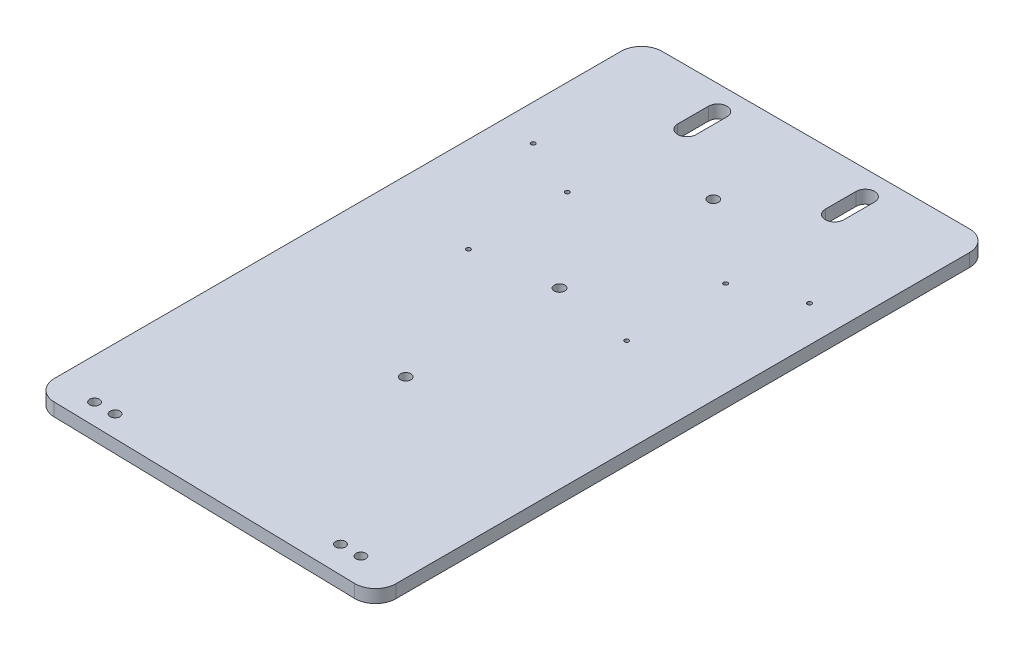
ISO-10303-21;
HEADER;
FILE_DESCRIPTION(('STEP AP214'),'2;1');
FILE_NAME('part.step','',(''),(''),'','','');
FILE_SCHEMA(('AUTOMOTIVE_DESIGN { 1 0 10303 214 1 1 1 1 }'));
ENDSEC;
DATA;
#1=APPLICATION_CONTEXT('core data for automotive mechanical design processes');
#2=APPLICATION_PROTOCOL_DEFINITION('international standard','automotive_design',2000,#1);
#3=PRODUCT_CONTEXT('',#1,'mechanical');
#4=PRODUCT('Part','Part','',(#3));
#5=PRODUCT_RELATED_PRODUCT_CATEGORY('part','',(#4));
#6=PRODUCT_DEFINITION_FORMATION('','',#4);
#7=PRODUCT_DEFINITION_CONTEXT('part definition',#1,'design');
#8=PRODUCT_DEFINITION('design','',#6,#7);
#9=PRODUCT_DEFINITION_SHAPE('','',#8);
#10=(LENGTH_UNIT() NAMED_UNIT(*) SI_UNIT(.MILLI.,.METRE.));
#11=(NAMED_UNIT(*) PLANE_ANGLE_UNIT() SI_UNIT($,.RADIAN.));
#12=(NAMED_UNIT(*) SI_UNIT($,.STERADIAN.) SOLID_ANGLE_UNIT());
#13=UNCERTAINTY_MEASURE_WITH_UNIT(LENGTH_MEASURE(1.E-05),#10,'distance_accuracy_value','');
#14=(GEOMETRIC_REPRESENTATION_CONTEXT(3) GLOBAL_UNCERTAINTY_ASSIGNED_CONTEXT((#13)) GLOBAL_UNIT_ASSIGNED_CONTEXT((#10,
#11,#12)) REPRESENTATION_CONTEXT('',''));
#15=CARTESIAN_POINT('',(0.,0.,0.));
#16=DIRECTION('',(0.,0.,1.));
#17=DIRECTION('',(1.,0.,0.));
#18=AXIS2_PLACEMENT_3D('',#15,#16,#17);
#19=CARTESIAN_POINT('',(183.637433784579,6.35,0.));
#20=DIRECTION('',(-1.,0.,0.));
#21=DIRECTION('',(0.,0.,-1.));
#22=AXIS2_PLACEMENT_3D('',#19,#20,#21);
#23=PLANE('',#22);
#24=DIRECTION('',(0.,1.,0.));
#25=VECTOR('',#24,1.);
#26=CARTESIAN_POINT('',(183.637433784579,6.35,289.76888142374));
#27=LINE('',#26,#25);
#28=CARTESIAN_POINT('',(183.637433784579,0.,289.76888142374));
#29=VERTEX_POINT('',#28);
#30=CARTESIAN_POINT('',(183.637433784579,6.35,289.76888142374));
#31=VERTEX_POINT('',#30);
#32=EDGE_CURVE('E11',#29,#31,#27,.T.);
#33=ORIENTED_EDGE('',*,*,#32,.F.);
#34=DIRECTION('',(0.,0.,-1.));
#35=VECTOR('',#34,1.);
#36=CARTESIAN_POINT('',(183.637433784579,0.,0.));
#37=LINE('',#36,#35);
#38=CARTESIAN_POINT('',(183.637433784579,0.,10.));
#39=VERTEX_POINT('',#38);
#40=EDGE_CURVE('E139',#29,#39,#37,.T.);
#41=ORIENTED_EDGE('',*,*,#40,.T.);
#42=DIRECTION('',(0.,1.,0.));
#43=VECTOR('',#42,1.);
#44=CARTESIAN_POINT('',(183.637433784579,6.35,10.));
#45=LINE('',#44,#43);
#46=CARTESIAN_POINT('',(183.637433784579,6.35,10.));
#47=VERTEX_POINT('',#46);
#48=EDGE_CURVE('E57',#39,#47,#45,.T.);
#49=ORIENTED_EDGE('',*,*,#48,.T.);
#50=DIRECTION('',(0.,0.,-1.));
#51=VECTOR('',#50,1.);
#52=CARTESIAN_POINT('',(183.637433784579,6.35,0.));
#53=LINE('',#52,#51);
#54=EDGE_CURVE('E205',#31,#47,#53,.T.);
#55=ORIENTED_EDGE('',*,*,#54,.F.);
#56=EDGE_LOOP('',(#33,#41,#49,#55));
#57=FACE_BOUND('',#56,.T.);
#58=ADVANCED_FACE('F47',(#57),#23,.F.);
#59=CARTESIAN_POINT('',(173.637433784579,6.35,10.));
#60=DIRECTION('',(0.,-1.,0.));
#61=DIRECTION('',(0.,0.,-1.));
#62=AXIS2_PLACEMENT_3D('',#59,#60,#61);
#63=CYLINDRICAL_SURFACE('',#62,10.);
#64=ORIENTED_EDGE('',*,*,#48,.F.);
#65=CARTESIAN_POINT('',(173.637433784579,0.,10.));
#66=DIRECTION('',(0.,-1.,0.));
#67=DIRECTION('',(0.,0.,-1.));
#68=AXIS2_PLACEMENT_3D('',#65,#66,#67);
#69=CIRCLE('',#68,10.);
#70=CARTESIAN_POINT('',(173.637433784579,0.,0.));
#71=VERTEX_POINT('',#70);
#72=EDGE_CURVE('E161',#39,#71,#69,.F.);
#73=ORIENTED_EDGE('',*,*,#72,.T.);
#74=DIRECTION('',(0.,1.,0.));
#75=VECTOR('',#74,1.);
#76=CARTESIAN_POINT('',(173.637433784579,6.35,0.));
#77=LINE('',#76,#75);
#78=CARTESIAN_POINT('',(173.637433784579,6.35,0.));
#79=VERTEX_POINT('',#78);
#80=EDGE_CURVE('E198',#71,#79,#77,.T.);
#81=ORIENTED_EDGE('',*,*,#80,.T.);
#82=CARTESIAN_POINT('',(173.637433784579,6.35,10.));
#83=DIRECTION('',(0.,-1.,0.));
#84=DIRECTION('',(0.,0.,-1.));
#85=AXIS2_PLACEMENT_3D('',#82,#83,#84);
#86=CIRCLE('',#85,10.);
#87=EDGE_CURVE('E214',#47,#79,#86,.F.);
#88=ORIENTED_EDGE('',*,*,#87,.F.);
#89=EDGE_LOOP('',(#64,#73,#81,#88));
#90=FACE_BOUND('',#89,.T.);
#91=ADVANCED_FACE('F217',(#90),#63,.T.);
#92=CARTESIAN_POINT('',(13.6374337845792,6.35,0.));
#93=DIRECTION('',(0.,0.,1.));
#94=DIRECTION('',(-1.,0.,0.));
#95=AXIS2_PLACEMENT_3D('',#92,#93,#94);
#96=PLANE('',#95);
#97=ORIENTED_EDGE('',*,*,#80,.F.);
#98=DIRECTION('',(1.,0.,0.));
#99=VECTOR('',#98,1.);
#100=CARTESIAN_POINT('',(0.,0.,0.));
#101=LINE('',#100,#99);
#102=CARTESIAN_POINT('',(23.6374337845792,0.,0.));
#103=VERTEX_POINT('',#102);
#104=EDGE_CURVE('E158',#71,#103,#101,.F.);
#105=ORIENTED_EDGE('',*,*,#104,.T.);
#106=DIRECTION('',(0.,1.,0.));
#107=VECTOR('',#106,1.);
#108=CARTESIAN_POINT('',(23.6374337845792,6.35,0.));
#109=LINE('',#108,#107);
#110=CARTESIAN_POINT('',(23.6374337845792,6.35,0.));
#111=VERTEX_POINT('',#110);
#112=EDGE_CURVE('E195',#103,#111,#109,.T.);
#113=ORIENTED_EDGE('',*,*,#112,.T.);
#114=DIRECTION('',(-1.,0.,0.));
#115=VECTOR('',#114,1.);
#116=CARTESIAN_POINT('',(13.6374337845792,6.35,0.));
#117=LINE('',#116,#115);
#118=EDGE_CURVE('E218',#79,#111,#117,.T.);
#119=ORIENTED_EDGE('',*,*,#118,.F.);
#120=EDGE_LOOP('',(#97,#105,#113,#119));
#121=FACE_BOUND('',#120,.T.);
#122=ADVANCED_FACE('F316',(#121),#96,.F.);
#123=CARTESIAN_POINT('',(23.6374337845792,6.35,10.));
#124=DIRECTION('',(0.,-1.,0.));
#125=DIRECTION('',(0.,0.,-1.));
#126=AXIS2_PLACEMENT_3D('',#123,#124,#125);
#127=CYLINDRICAL_SURFACE('',#126,10.);
#128=ORIENTED_EDGE('',*,*,#112,.F.);
#129=CARTESIAN_POINT('',(23.6374337845792,0.,10.));
#130=DIRECTION('',(0.,-1.,0.));
#131=DIRECTION('',(0.,0.,-1.));
#132=AXIS2_PLACEMENT_3D('',#129,#130,#131);
#133=CIRCLE('',#132,10.);
#134=CARTESIAN_POINT('',(13.6374337845792,0.,10.));
#135=VERTEX_POINT('',#134);
#136=EDGE_CURVE('E155',#103,#135,#133,.F.);
#137=ORIENTED_EDGE('',*,*,#136,.T.);
#138=DIRECTION('',(0.,1.,0.));
#139=VECTOR('',#138,1.);
#140=CARTESIAN_POINT('',(13.6374337845792,6.35,10.));
#141=LINE('',#140,#139);
#142=CARTESIAN_POINT('',(13.6374337845792,6.35,10.));
#143=VERTEX_POINT('',#142);
#144=EDGE_CURVE('E192',#135,#143,#141,.T.);
#145=ORIENTED_EDGE('',*,*,#144,.T.);
#146=CARTESIAN_POINT('',(23.6374337845792,6.35,10.));
#147=DIRECTION('',(0.,-1.,0.));
#148=DIRECTION('',(0.,0.,-1.));
#149=AXIS2_PLACEMENT_3D('',#146,#147,#148);
#150=CIRCLE('',#149,10.);
#151=EDGE_CURVE('E220',#111,#143,#150,.F.);
#152=ORIENTED_EDGE('',*,*,#151,.F.);
#153=EDGE_LOOP('',(#128,#137,#145,#152));
#154=FACE_BOUND('',#153,.T.);
#155=ADVANCED_FACE('F321',(#154),#127,.T.);
#156=CARTESIAN_POINT('',(13.6374337845792,6.35,296.115361977634));
#157=DIRECTION('',(1.,0.,0.));
#158=DIRECTION('',(0.,0.,1.));
#159=AXIS2_PLACEMENT_3D('',#156,#157,#158);
#160=PLANE('',#159);
#161=ORIENTED_EDGE('',*,*,#144,.F.);
#162=DIRECTION('',(0.,0.,-1.));
#163=VECTOR('',#162,1.);
#164=CARTESIAN_POINT('',(13.6374337845792,0.,0.));
#165=LINE('',#164,#163);
#166=CARTESIAN_POINT('',(13.6374337845792,0.,286.341259639299));
#167=VERTEX_POINT('',#166);
#168=EDGE_CURVE('E152',#135,#167,#165,.F.);
#169=ORIENTED_EDGE('',*,*,#168,.T.);
#170=DIRECTION('',(0.,1.,0.));
#171=VECTOR('',#170,1.);
#172=CARTESIAN_POINT('',(13.6374337845792,6.35,286.341259639299));
#173=LINE('',#172,#171);
#174=CARTESIAN_POINT('',(13.6374337845792,6.35,286.341259639299));
#175=VERTEX_POINT('',#174);
#176=EDGE_CURVE('E190',#167,#175,#173,.T.);
#177=ORIENTED_EDGE('',*,*,#176,.T.);
#178=DIRECTION('',(0.,0.,1.));
#179=VECTOR('',#178,1.);
#180=CARTESIAN_POINT('',(13.6374337845792,6.35,296.115361977634));
#181=LINE('',#180,#179);
#182=EDGE_CURVE('E226',#143,#175,#181,.T.);
#183=ORIENTED_EDGE('',*,*,#182,.F.);
#184=EDGE_LOOP('',(#161,#169,#177,#183));
#185=FACE_BOUND('',#184,.T.);
#186=ADVANCED_FACE('F325',(#185),#160,.F.);
#187=CARTESIAN_POINT('',(23.6374337845792,6.35,286.341259639299));
#188=DIRECTION('',(0.,-1.,0.));
#189=DIRECTION('',(0.,0.,-1.));
#190=AXIS2_PLACEMENT_3D('',#187,#188,#189);
#191=CYLINDRICAL_SURFACE('',#190,10.);
#192=ORIENTED_EDGE('',*,*,#176,.F.);
#193=CARTESIAN_POINT('',(23.6374337845792,0.,286.341259639299));
#194=DIRECTION('',(0.,-1.,0.));
#195=DIRECTION('',(0.,0.,-1.));
#196=AXIS2_PLACEMENT_3D('',#193,#194,#195);
#197=CIRCLE('',#196,10.);
#198=CARTESIAN_POINT('',(23.4089853011175,0.,296.338649863273));
#199=VERTEX_POINT('',#198);
#200=EDGE_CURVE('E149',#167,#199,#197,.F.);
#201=ORIENTED_EDGE('',*,*,#200,.T.);
#202=DIRECTION('',(0.,1.,0.));
#203=VECTOR('',#202,1.);
#204=CARTESIAN_POINT('',(23.4089853011175,6.35,296.338649863273));
#205=LINE('',#204,#203);
#206=CARTESIAN_POINT('',(23.4089853011175,6.35,296.338649863273));
#207=VERTEX_POINT('',#206);
#208=EDGE_CURVE('E65',#199,#207,#205,.T.);
#209=ORIENTED_EDGE('',*,*,#208,.T.);
#210=CARTESIAN_POINT('',(23.6374337845792,6.35,286.341259639299));
#211=DIRECTION('',(0.,-1.,0.));
#212=DIRECTION('',(0.,0.,-1.));
#213=AXIS2_PLACEMENT_3D('',#210,#211,#212);
#214=CIRCLE('',#213,10.);
#215=EDGE_CURVE('E178',#175,#207,#214,.F.);
#216=ORIENTED_EDGE('',*,*,#215,.F.);
#217=EDGE_LOOP('',(#192,#201,#209,#216));
#218=FACE_BOUND('',#217,.T.);
#219=ADVANCED_FACE('F329',(#218),#191,.T.);
#220=CARTESIAN_POINT('',(183.637433784579,6.35,300.));
#221=DIRECTION('',(0.0228448483461643,0.,-0.999739022397366));
#222=DIRECTION('',(0.999739022397366,0.,0.0228448483461643));
#223=AXIS2_PLACEMENT_3D('',#220,#221,#222);
#224=PLANE('',#223);
#225=ORIENTED_EDGE('',*,*,#208,.F.);
#226=DIRECTION('',(0.999739022397366,0.,0.0228448483461643));
#227=VECTOR('',#226,1.);
#228=CARTESIAN_POINT('',(183.637433784579,0.,300.));
#229=LINE('',#228,#227);
#230=CARTESIAN_POINT('',(173.408985301117,0.,299.766271647714));
#231=VERTEX_POINT('',#230);
#232=EDGE_CURVE('E137',#199,#231,#229,.T.);
#233=ORIENTED_EDGE('',*,*,#232,.T.);
#234=DIRECTION('',(0.,1.,0.));
#235=VECTOR('',#234,1.);
#236=CARTESIAN_POINT('',(173.408985301117,6.35,299.766271647714));
#237=LINE('',#236,#235);
#238=CARTESIAN_POINT('',(173.408985301117,6.35,299.766271647714));
#239=VERTEX_POINT('',#238);
#240=EDGE_CURVE('E51',#231,#239,#237,.T.);
#241=ORIENTED_EDGE('',*,*,#240,.T.);
#242=DIRECTION('',(0.999739022397366,0.,0.0228448483461643));
#243=VECTOR('',#242,1.);
#244=CARTESIAN_POINT('',(183.637433784579,6.35,300.));
#245=LINE('',#244,#243);
#246=EDGE_CURVE('E377',#207,#239,#245,.T.);
#247=ORIENTED_EDGE('',*,*,#246,.F.);
#248=EDGE_LOOP('',(#225,#233,#241,#247));
#249=FACE_BOUND('',#248,.T.);
#250=ADVANCED_FACE('F141',(#249),#224,.F.);
#251=CARTESIAN_POINT('',(58.1374337846267,6.35,26.8450598136873));
#252=DIRECTION('',(1.,0.,0.));
#253=DIRECTION('',(0.,0.,1.));
#254=AXIS2_PLACEMENT_3D('',#251,#252,#253);
#255=PLANE('',#254);
#256=DIRECTION('',(0.,1.,0.));
#257=VECTOR('',#256,1.);
#258=CARTESIAN_POINT('',(58.1374337846267,6.35,26.8450598136873));
#259=LINE('',#258,#257);
#260=CARTESIAN_POINT('',(58.1374337846267,0.,26.8450598136873));
#261=VERTEX_POINT('',#260);
#262=CARTESIAN_POINT('',(58.1374337846267,6.35,26.8450598136873));
#263=VERTEX_POINT('',#262);
#264=EDGE_CURVE('E132',#261,#263,#259,.T.);
#265=ORIENTED_EDGE('',*,*,#264,.F.);
#266=DIRECTION('',(0.,0.,-1.));
#267=VECTOR('',#266,1.);
#268=CARTESIAN_POINT('',(58.1374337846268,0.,0.));
#269=LINE('',#268,#267);
#270=CARTESIAN_POINT('',(58.1374337846268,0.,11.8450598136873));
#271=VERTEX_POINT('',#270);
#272=EDGE_CURVE('E281',#271,#261,#269,.F.);
#273=ORIENTED_EDGE('',*,*,#272,.F.);
#274=DIRECTION('',(0.,1.,0.));
#275=VECTOR('',#274,1.);
#276=CARTESIAN_POINT('',(58.1374337846268,6.35,11.8450598136873));
#277=LINE('',#276,#275);
#278=CARTESIAN_POINT('',(58.1374337846268,6.35,11.8450598136873));
#279=VERTEX_POINT('',#278);
#280=EDGE_CURVE('E182',#271,#279,#277,.T.);
#281=ORIENTED_EDGE('',*,*,#280,.T.);
#282=DIRECTION('',(0.,0.,1.));
#283=VECTOR('',#282,1.);
#284=CARTESIAN_POINT('',(58.1374337846267,6.35,26.8450598136873));
#285=LINE('',#284,#283);
#286=EDGE_CURVE('E371',#279,#263,#285,.T.);
#287=ORIENTED_EDGE('',*,*,#286,.T.);
#288=EDGE_LOOP('',(#265,#273,#281,#287));
#289=FACE_BOUND('',#288,.T.);
#290=ADVANCED_FACE('F333',(#289),#255,.T.);
#291=CARTESIAN_POINT('',(62.6374337846267,6.35,11.8450598136873));
#292=DIRECTION('',(0.,-1.,0.));
#293=DIRECTION('',(0.,0.,-1.));
#294=AXIS2_PLACEMENT_3D('',#291,#292,#293);
#295=CYLINDRICAL_SURFACE('',#294,4.49999999999999);
#296=ORIENTED_EDGE('',*,*,#280,.F.);
#297=CARTESIAN_POINT('',(62.6374337846267,0.,11.8450598136873));
#298=DIRECTION('',(0.,1.,0.));
#299=DIRECTION('',(0.,0.,1.));
#300=AXIS2_PLACEMENT_3D('',#297,#298,#299);
#301=CIRCLE('',#300,4.49999999999999);
#302=CARTESIAN_POINT('',(67.1374337846267,0.,11.8450598136873));
#303=VERTEX_POINT('',#302);
#304=EDGE_CURVE('E277',#303,#271,#301,.T.);
#305=ORIENTED_EDGE('',*,*,#304,.F.);
#306=DIRECTION('',(0.,1.,0.));
#307=VECTOR('',#306,1.);
#308=CARTESIAN_POINT('',(67.1374337846267,6.35,11.8450598136873));
#309=LINE('',#308,#307);
#310=CARTESIAN_POINT('',(67.1374337846267,6.35,11.8450598136873));
#311=VERTEX_POINT('',#310);
#312=EDGE_CURVE('E179',#303,#311,#309,.T.);
#313=ORIENTED_EDGE('',*,*,#312,.T.);
#314=CARTESIAN_POINT('',(62.6374337846267,6.35,11.8450598136873));
#315=DIRECTION('',(0.,1.,0.));
#316=DIRECTION('',(0.,0.,-1.));
#317=AXIS2_PLACEMENT_3D('',#314,#315,#316);
#318=CIRCLE('',#317,4.49999999999999);
#319=EDGE_CURVE('E365',#311,#279,#318,.T.);
#320=ORIENTED_EDGE('',*,*,#319,.T.);
#321=EDGE_LOOP('',(#296,#305,#313,#320));
#322=FACE_BOUND('',#321,.T.);
#323=ADVANCED_FACE('F337',(#322),#295,.F.);
#324=CARTESIAN_POINT('',(67.1374337846268,6.35,26.8450598136873));
#325=DIRECTION('',(-1.,0.,0.));
#326=DIRECTION('',(0.,0.,-1.));
#327=AXIS2_PLACEMENT_3D('',#324,#325,#326);
#328=PLANE('',#327);
#329=ORIENTED_EDGE('',*,*,#312,.F.);
#330=DIRECTION('',(0.,0.,-1.));
#331=VECTOR('',#330,1.);
#332=CARTESIAN_POINT('',(67.1374337846268,0.,0.));
#333=LINE('',#332,#331);
#334=CARTESIAN_POINT('',(67.1374337846268,0.,26.8450598136873));
#335=VERTEX_POINT('',#334);
#336=EDGE_CURVE('E268',#335,#303,#333,.T.);
#337=ORIENTED_EDGE('',*,*,#336,.F.);
#338=DIRECTION('',(0.,1.,0.));
#339=VECTOR('',#338,1.);
#340=CARTESIAN_POINT('',(67.1374337846268,6.35,26.8450598136873));
#341=LINE('',#340,#339);
#342=CARTESIAN_POINT('',(67.1374337846268,6.35,26.8450598136873));
#343=VERTEX_POINT('',#342);
#344=EDGE_CURVE('E175',#335,#343,#341,.T.);
#345=ORIENTED_EDGE('',*,*,#344,.T.);
#346=DIRECTION('',(0.,0.,-1.));
#347=VECTOR('',#346,1.);
#348=CARTESIAN_POINT('',(67.1374337846268,6.35,26.8450598136873));
#349=LINE('',#348,#347);
#350=EDGE_CURVE('E429',#343,#311,#349,.T.);
#351=ORIENTED_EDGE('',*,*,#350,.T.);
#352=EDGE_LOOP('',(#329,#337,#345,#351));
#353=FACE_BOUND('',#352,.T.);
#354=ADVANCED_FACE('F343',(#353),#328,.T.);
#355=CARTESIAN_POINT('',(130.137433784532,6.35,26.8450598136873));
#356=DIRECTION('',(1.,0.,0.));
#357=DIRECTION('',(0.,0.,1.));
#358=AXIS2_PLACEMENT_3D('',#355,#356,#357);
#359=PLANE('',#358);
#360=DIRECTION('',(0.,1.,0.));
#361=VECTOR('',#360,1.);
#362=CARTESIAN_POINT('',(130.137433784532,6.35,26.8450598136873));
#363=LINE('',#362,#361);
#364=CARTESIAN_POINT('',(130.137433784532,0.,26.8450598136873));
#365=VERTEX_POINT('',#364);
#366=CARTESIAN_POINT('',(130.137433784532,6.35,26.8450598136873));
#367=VERTEX_POINT('',#366);
#368=EDGE_CURVE('E172',#365,#367,#363,.T.);
#369=ORIENTED_EDGE('',*,*,#368,.F.);
#370=DIRECTION('',(0.,0.,-1.));
#371=VECTOR('',#370,1.);
#372=CARTESIAN_POINT('',(130.137433784532,0.,0.));
#373=LINE('',#372,#371);
#374=CARTESIAN_POINT('',(130.137433784532,0.,11.8450598136873));
#375=VERTEX_POINT('',#374);
#376=EDGE_CURVE('E269',#375,#365,#373,.F.);
#377=ORIENTED_EDGE('',*,*,#376,.F.);
#378=DIRECTION('',(0.,1.,0.));
#379=VECTOR('',#378,1.);
#380=CARTESIAN_POINT('',(130.137433784532,6.35,11.8450598136873));
#381=LINE('',#380,#379);
#382=CARTESIAN_POINT('',(130.137433784532,6.35,11.8450598136873));
#383=VERTEX_POINT('',#382);
#384=EDGE_CURVE('E168',#375,#383,#381,.T.);
#385=ORIENTED_EDGE('',*,*,#384,.T.);
#386=DIRECTION('',(0.,0.,1.));
#387=VECTOR('',#386,1.);
#388=CARTESIAN_POINT('',(130.137433784532,6.35,26.8450598136873));
#389=LINE('',#388,#387);
#390=EDGE_CURVE('E423',#383,#367,#389,.T.);
#391=ORIENTED_EDGE('',*,*,#390,.T.);
#392=EDGE_LOOP('',(#369,#377,#385,#391));
#393=FACE_BOUND('',#392,.T.);
#394=ADVANCED_FACE('F446',(#393),#359,.T.);
#395=CARTESIAN_POINT('',(134.637433784532,6.35,11.8450598136873));
#396=DIRECTION('',(0.,-1.,0.));
#397=DIRECTION('',(0.,0.,-1.));
#398=AXIS2_PLACEMENT_3D('',#395,#396,#397);
#399=CYLINDRICAL_SURFACE('',#398,4.49999999999999);
#400=ORIENTED_EDGE('',*,*,#384,.F.);
#401=CARTESIAN_POINT('',(134.637433784532,0.,11.8450598136873));
#402=DIRECTION('',(0.,1.,0.));
#403=DIRECTION('',(0.,0.,1.));
#404=AXIS2_PLACEMENT_3D('',#401,#402,#403);
#405=CIRCLE('',#404,4.49999999999999);
#406=CARTESIAN_POINT('',(139.137433784532,0.,11.8450598136873));
#407=VERTEX_POINT('',#406);
#408=EDGE_CURVE('E265',#407,#375,#405,.T.);
#409=ORIENTED_EDGE('',*,*,#408,.F.);
#410=DIRECTION('',(0.,1.,0.));
#411=VECTOR('',#410,1.);
#412=CARTESIAN_POINT('',(139.137433784532,6.35,11.8450598136873));
#413=LINE('',#412,#411);
#414=CARTESIAN_POINT('',(139.137433784532,6.35,11.8450598136873));
#415=VERTEX_POINT('',#414);
#416=EDGE_CURVE('E165',#407,#415,#413,.T.);
#417=ORIENTED_EDGE('',*,*,#416,.T.);
#418=CARTESIAN_POINT('',(134.637433784532,6.35,11.8450598136873));
#419=DIRECTION('',(0.,1.,0.));
#420=DIRECTION('',(0.,0.,1.));
#421=AXIS2_PLACEMENT_3D('',#418,#419,#420);
#422=CIRCLE('',#421,4.49999999999999);
#423=EDGE_CURVE('E420',#415,#383,#422,.T.);
#424=ORIENTED_EDGE('',*,*,#423,.T.);
#425=EDGE_LOOP('',(#400,#409,#417,#424));
#426=FACE_BOUND('',#425,.T.);
#427=ADVANCED_FACE('F450',(#426),#399,.F.);
#428=CARTESIAN_POINT('',(139.137433784532,6.35,26.8450598136873));
#429=DIRECTION('',(-1.,0.,0.));
#430=DIRECTION('',(0.,0.,-1.));
#431=AXIS2_PLACEMENT_3D('',#428,#429,#430);
#432=PLANE('',#431);
#433=ORIENTED_EDGE('',*,*,#416,.F.);
#434=DIRECTION('',(0.,0.,-1.));
#435=VECTOR('',#434,1.);
#436=CARTESIAN_POINT('',(139.137433784532,0.,0.));
#437=LINE('',#436,#435);
#438=CARTESIAN_POINT('',(139.137433784532,0.,26.8450598136873));
#439=VERTEX_POINT('',#438);
#440=EDGE_CURVE('E261',#439,#407,#437,.T.);
#441=ORIENTED_EDGE('',*,*,#440,.F.);
#442=DIRECTION('',(0.,1.,0.));
#443=VECTOR('',#442,1.);
#444=CARTESIAN_POINT('',(139.137433784532,6.35,26.8450598136873));
#445=LINE('',#444,#443);
#446=CARTESIAN_POINT('',(139.137433784532,6.35,26.8450598136873));
#447=VERTEX_POINT('',#446);
#448=EDGE_CURVE('E169',#439,#447,#445,.T.);
#449=ORIENTED_EDGE('',*,*,#448,.T.);
#450=DIRECTION('',(0.,0.,-1.));
#451=VECTOR('',#450,1.);
#452=CARTESIAN_POINT('',(139.137433784532,6.35,26.8450598136873));
#453=LINE('',#452,#451);
#454=EDGE_CURVE('E408',#447,#415,#453,.T.);
#455=ORIENTED_EDGE('',*,*,#454,.T.);
#456=EDGE_LOOP('',(#433,#441,#449,#455));
#457=FACE_BOUND('',#456,.T.);
#458=ADVANCED_FACE('F407',(#457),#432,.T.);
#459=CARTESIAN_POINT('',(33.4089853011175,6.35,286.564547524938));
#460=DIRECTION('',(0.,-1.,0.));
#461=DIRECTION('',(0.,0.,-1.));
#462=AXIS2_PLACEMENT_3D('',#459,#460,#461);
#463=CYLINDRICAL_SURFACE('',#462,2.38125000000002);
#464=CARTESIAN_POINT('',(33.4089853011175,6.35,286.564547524938));
#465=DIRECTION('',(0.,1.,0.));
#466=DIRECTION('',(0.,0.,1.));
#467=AXIS2_PLACEMENT_3D('',#464,#465,#466);
#468=CIRCLE('',#467,2.38125000000002);
#469=CARTESIAN_POINT('',(33.4089853011175,6.35,288.945797524938));
#470=VERTEX_POINT('',#469);
#471=EDGE_CURVE('E151',#470,#470,#468,.T.);
#472=ORIENTED_EDGE('',*,*,#471,.T.);
#473=EDGE_LOOP('',(#472));
#474=FACE_BOUND('',#473,.T.);
#475=CARTESIAN_POINT('',(33.4089853011175,0.,286.564547524938));
#476=DIRECTION('',(0.,1.,0.));
#477=DIRECTION('',(0.,0.,1.));
#478=AXIS2_PLACEMENT_3D('',#475,#476,#477);
#479=CIRCLE('',#478,2.38125000000002);
#480=CARTESIAN_POINT('',(33.4089853011175,0.,288.945797524938));
#481=VERTEX_POINT('',#480);
#482=EDGE_CURVE('E231',#481,#481,#479,.T.);
#483=ORIENTED_EDGE('',*,*,#482,.F.);
#484=EDGE_LOOP('',(#483));
#485=FACE_BOUND('',#484,.T.);
#486=ADVANCED_FACE('F462',(#474,#485),#463,.F.);
#487=CARTESIAN_POINT('',(43.4089853011175,6.35,286.564547524938));
#488=DIRECTION('',(0.,-1.,0.));
#489=DIRECTION('',(0.,0.,-1.));
#490=AXIS2_PLACEMENT_3D('',#487,#488,#489);
#491=CYLINDRICAL_SURFACE('',#490,2.38125000000003);
#492=CARTESIAN_POINT('',(43.4089853011175,6.35,286.564547524938));
#493=DIRECTION('',(0.,1.,0.));
#494=DIRECTION('',(0.,0.,1.));
#495=AXIS2_PLACEMENT_3D('',#492,#493,#494);
#496=CIRCLE('',#495,2.38125000000003);
#497=CARTESIAN_POINT('',(43.4089853011175,6.35,288.945797524938));
#498=VERTEX_POINT('',#497);
#499=EDGE_CURVE('E514',#498,#498,#496,.T.);
#500=ORIENTED_EDGE('',*,*,#499,.T.);
#501=EDGE_LOOP('',(#500));
#502=FACE_BOUND('',#501,.T.);
#503=CARTESIAN_POINT('',(43.4089853011175,0.,286.564547524938));
#504=DIRECTION('',(0.,1.,0.));
#505=DIRECTION('',(0.,0.,1.));
#506=AXIS2_PLACEMENT_3D('',#503,#504,#505);
#507=CIRCLE('',#506,2.38125000000003);
#508=CARTESIAN_POINT('',(43.4089853011175,0.,288.945797524938));
#509=VERTEX_POINT('',#508);
#510=EDGE_CURVE('E234',#509,#509,#507,.T.);
#511=ORIENTED_EDGE('',*,*,#510,.F.);
#512=EDGE_LOOP('',(#511));
#513=FACE_BOUND('',#512,.T.);
#514=ADVANCED_FACE('F493',(#502,#513),#491,.F.);
#515=CARTESIAN_POINT('',(153.426530966494,6.35,286.648872752107));
#516=DIRECTION('',(0.,-1.,0.));
#517=DIRECTION('',(0.,0.,-1.));
#518=AXIS2_PLACEMENT_3D('',#515,#516,#517);
#519=CYLINDRICAL_SURFACE('',#518,2.38125000000001);
#520=CARTESIAN_POINT('',(153.426530966494,6.35,286.648872752107));
#521=DIRECTION('',(0.,1.,0.));
#522=DIRECTION('',(0.,0.,-1.));
#523=AXIS2_PLACEMENT_3D('',#520,#521,#522);
#524=CIRCLE('',#523,2.38125000000001);
#525=CARTESIAN_POINT('',(153.426530966494,6.35,284.267622752107));
#526=VERTEX_POINT('',#525);
#527=EDGE_CURVE('E518',#526,#526,#524,.T.);
#528=ORIENTED_EDGE('',*,*,#527,.T.);
#529=EDGE_LOOP('',(#528));
#530=FACE_BOUND('',#529,.T.);
#531=CARTESIAN_POINT('',(153.426530966494,0.,286.648872752107));
#532=DIRECTION('',(0.,1.,0.));
#533=DIRECTION('',(0.,0.,1.));
#534=AXIS2_PLACEMENT_3D('',#531,#532,#533);
#535=CIRCLE('',#534,2.38125000000001);
#536=CARTESIAN_POINT('',(153.426530966494,0.,289.030122752107));
#537=VERTEX_POINT('',#536);
#538=EDGE_CURVE('E237',#537,#537,#535,.T.);
#539=ORIENTED_EDGE('',*,*,#538,.F.);
#540=EDGE_LOOP('',(#539));
#541=FACE_BOUND('',#540,.T.);
#542=ADVANCED_FACE('F489',(#530,#541),#519,.F.);
#543=CARTESIAN_POINT('',(163.426519216954,6.35,286.664202157453));
#544=DIRECTION('',(0.,-1.,0.));
#545=DIRECTION('',(0.,0.,-1.));
#546=AXIS2_PLACEMENT_3D('',#543,#544,#545);
#547=CYLINDRICAL_SURFACE('',#546,2.38125000000004);
#548=CARTESIAN_POINT('',(163.426519216954,6.35,286.664202157453));
#549=DIRECTION('',(0.,1.,0.));
#550=DIRECTION('',(0.,0.,-1.));
#551=AXIS2_PLACEMENT_3D('',#548,#549,#550);
#552=CIRCLE('',#551,2.38125000000004);
#553=CARTESIAN_POINT('',(163.426519216954,6.35,284.282952157452));
#554=VERTEX_POINT('',#553);
#555=EDGE_CURVE('E522',#554,#554,#552,.T.);
#556=ORIENTED_EDGE('',*,*,#555,.T.);
#557=EDGE_LOOP('',(#556));
#558=FACE_BOUND('',#557,.T.);
#559=CARTESIAN_POINT('',(163.426519216954,0.,286.664202157453));
#560=DIRECTION('',(0.,1.,0.));
#561=DIRECTION('',(0.,0.,1.));
#562=AXIS2_PLACEMENT_3D('',#559,#560,#561);
#563=CIRCLE('',#562,2.38125000000004);
#564=CARTESIAN_POINT('',(163.426519216954,0.,289.045452157453));
#565=VERTEX_POINT('',#564);
#566=EDGE_CURVE('E240',#565,#565,#563,.T.);
#567=ORIENTED_EDGE('',*,*,#566,.F.);
#568=EDGE_LOOP('',(#567));
#569=FACE_BOUND('',#568,.T.);
#570=ADVANCED_FACE('F485',(#558,#569),#547,.F.);
#571=CARTESIAN_POINT('',(31.1374337845792,6.35,70.35));
#572=DIRECTION('',(0.,-1.,0.));
#573=DIRECTION('',(0.,0.,-1.));
#574=AXIS2_PLACEMENT_3D('',#571,#572,#573);
#575=CYLINDRICAL_SURFACE('',#574,1.025);
#576=CARTESIAN_POINT('',(31.1374337845792,6.35,70.35));
#577=DIRECTION('',(0.,1.,0.));
#578=DIRECTION('',(0.,0.,1.));
#579=AXIS2_PLACEMENT_3D('',#576,#577,#578);
#580=CIRCLE('',#579,1.025);
#581=CARTESIAN_POINT('',(31.1374337845792,6.35,71.375));
#582=VERTEX_POINT('',#581);
#583=EDGE_CURVE('E526',#582,#582,#580,.T.);
#584=ORIENTED_EDGE('',*,*,#583,.T.);
#585=EDGE_LOOP('',(#584));
#586=FACE_BOUND('',#585,.T.);
#587=CARTESIAN_POINT('',(31.1374337845792,0.,70.35));
#588=DIRECTION('',(0.,1.,0.));
#589=DIRECTION('',(0.,0.,1.));
#590=AXIS2_PLACEMENT_3D('',#587,#588,#589);
#591=CIRCLE('',#590,1.025);
#592=CARTESIAN_POINT('',(31.1374337845792,0.,71.375));
#593=VERTEX_POINT('',#592);
#594=EDGE_CURVE('E243',#593,#593,#591,.T.);
#595=ORIENTED_EDGE('',*,*,#594,.F.);
#596=EDGE_LOOP('',(#595));
#597=FACE_BOUND('',#596,.T.);
#598=ADVANCED_FACE('F481',(#586,#597),#575,.F.);
#599=CARTESIAN_POINT('',(166.029512108578,6.35,70.4533908280643));
#600=DIRECTION('',(0.,-1.,0.));
#601=DIRECTION('',(0.,0.,-1.));
#602=AXIS2_PLACEMENT_3D('',#599,#600,#601);
#603=CYLINDRICAL_SURFACE('',#602,1.025);
#604=CARTESIAN_POINT('',(166.029512108578,6.35,70.4533908280643));
#605=DIRECTION('',(0.,1.,0.));
#606=DIRECTION('',(0.,0.,1.));
#607=AXIS2_PLACEMENT_3D('',#604,#605,#606);
#608=CIRCLE('',#607,1.025);
#609=CARTESIAN_POINT('',(166.029512108578,6.35,71.4783908280643));
#610=VERTEX_POINT('',#609);
#611=EDGE_CURVE('E530',#610,#610,#608,.T.);
#612=ORIENTED_EDGE('',*,*,#611,.T.);
#613=EDGE_LOOP('',(#612));
#614=FACE_BOUND('',#613,.T.);
#615=CARTESIAN_POINT('',(166.029512108578,0.,70.4533908280643));
#616=DIRECTION('',(0.,1.,0.));
#617=DIRECTION('',(0.,0.,1.));
#618=AXIS2_PLACEMENT_3D('',#615,#616,#617);
#619=CIRCLE('',#618,1.025);
#620=CARTESIAN_POINT('',(166.029512108578,0.,71.4783908280643));
#621=VERTEX_POINT('',#620);
#622=EDGE_CURVE('E246',#621,#621,#619,.T.);
#623=ORIENTED_EDGE('',*,*,#622,.F.);
#624=EDGE_LOOP('',(#623));
#625=FACE_BOUND('',#624,.T.);
#626=ADVANCED_FACE('F477',(#614,#625),#603,.F.);
#627=CARTESIAN_POINT('',(60.0274337845322,6.35,82.595059813688));
#628=DIRECTION('',(0.,-1.,0.));
#629=DIRECTION('',(0.,0.,-1.));
#630=AXIS2_PLACEMENT_3D('',#627,#628,#629);
#631=CYLINDRICAL_SURFACE('',#630,1.025);
#632=CARTESIAN_POINT('',(60.0274337845322,6.35,82.595059813688));
#633=DIRECTION('',(0.,1.,0.));
#634=DIRECTION('',(0.,0.,1.));
#635=AXIS2_PLACEMENT_3D('',#632,#633,#634);
#636=CIRCLE('',#635,1.025);
#637=CARTESIAN_POINT('',(60.0274337845322,6.35,83.620059813688));
#638=VERTEX_POINT('',#637);
#639=EDGE_CURVE('E534',#638,#638,#636,.T.);
#640=ORIENTED_EDGE('',*,*,#639,.T.);
#641=EDGE_LOOP('',(#640));
#642=FACE_BOUND('',#641,.T.);
#643=CARTESIAN_POINT('',(60.0274337845322,0.,82.595059813688));
#644=DIRECTION('',(0.,1.,0.));
#645=DIRECTION('',(0.,0.,1.));
#646=AXIS2_PLACEMENT_3D('',#643,#644,#645);
#647=CIRCLE('',#646,1.025);
#648=CARTESIAN_POINT('',(60.0274337845322,0.,83.620059813688));
#649=VERTEX_POINT('',#648);
#650=EDGE_CURVE('E249',#649,#649,#647,.T.);
#651=ORIENTED_EDGE('',*,*,#650,.F.);
#652=EDGE_LOOP('',(#651));
#653=FACE_BOUND('',#652,.T.);
#654=ADVANCED_FACE('F473',(#642,#653),#631,.F.);
#655=CARTESIAN_POINT('',(137.247433784532,6.35,82.5950598136872));
#656=DIRECTION('',(0.,-1.,0.));
#657=DIRECTION('',(0.,0.,-1.));
#658=AXIS2_PLACEMENT_3D('',#655,#656,#657);
#659=CYLINDRICAL_SURFACE('',#658,1.025);
#660=CARTESIAN_POINT('',(137.247433784532,6.35,82.5950598136872));
#661=DIRECTION('',(0.,1.,0.));
#662=DIRECTION('',(0.,0.,1.));
#663=AXIS2_PLACEMENT_3D('',#660,#661,#662);
#664=CIRCLE('',#663,1.025);
#665=CARTESIAN_POINT('',(137.247433784532,6.35,83.6200598136872));
#666=VERTEX_POINT('',#665);
#667=EDGE_CURVE('E538',#666,#666,#664,.T.);
#668=ORIENTED_EDGE('',*,*,#667,.T.);
#669=EDGE_LOOP('',(#668));
#670=FACE_BOUND('',#669,.T.);
#671=CARTESIAN_POINT('',(137.247433784532,0.,82.5950598136872));
#672=DIRECTION('',(0.,1.,0.));
#673=DIRECTION('',(0.,0.,1.));
#674=AXIS2_PLACEMENT_3D('',#671,#672,#673);
#675=CIRCLE('',#674,1.025);
#676=CARTESIAN_POINT('',(137.247433784532,0.,83.6200598136872));
#677=VERTEX_POINT('',#676);
#678=EDGE_CURVE('E252',#677,#677,#675,.T.);
#679=ORIENTED_EDGE('',*,*,#678,.F.);
#680=EDGE_LOOP('',(#679));
#681=FACE_BOUND('',#680,.T.);
#682=ADVANCED_FACE('F469',(#670,#681),#659,.F.);
#683=CARTESIAN_POINT('',(137.247433784533,6.35,130.855059813687));
#684=DIRECTION('',(0.,-1.,0.));
#685=DIRECTION('',(0.,0.,-1.));
#686=AXIS2_PLACEMENT_3D('',#683,#684,#685);
#687=CYLINDRICAL_SURFACE('',#686,1.025);
#688=CARTESIAN_POINT('',(137.247433784533,6.35,130.855059813687));
#689=DIRECTION('',(0.,1.,0.));
#690=DIRECTION('',(0.,0.,1.));
#691=AXIS2_PLACEMENT_3D('',#688,#689,#690);
#692=CIRCLE('',#691,1.025);
#693=CARTESIAN_POINT('',(137.247433784533,6.35,131.880059813687));
#694=VERTEX_POINT('',#693);
#695=EDGE_CURVE('E542',#694,#694,#692,.T.);
#696=ORIENTED_EDGE('',*,*,#695,.T.);
#697=EDGE_LOOP('',(#696));
#698=FACE_BOUND('',#697,.T.);
#699=CARTESIAN_POINT('',(137.247433784533,0.,130.855059813687));
#700=DIRECTION('',(0.,1.,0.));
#701=DIRECTION('',(0.,0.,1.));
#702=AXIS2_PLACEMENT_3D('',#699,#700,#701);
#703=CIRCLE('',#702,1.025);
#704=CARTESIAN_POINT('',(137.247433784533,0.,131.880059813687));
#705=VERTEX_POINT('',#704);
#706=EDGE_CURVE('E255',#705,#705,#703,.T.);
#707=ORIENTED_EDGE('',*,*,#706,.F.);
#708=EDGE_LOOP('',(#707));
#709=FACE_BOUND('',#708,.T.);
#710=ADVANCED_FACE('F465',(#698,#709),#687,.F.);
#711=CARTESIAN_POINT('',(60.0274337845327,6.35,130.855059813688));
#712=DIRECTION('',(0.,-1.,0.));
#713=DIRECTION('',(0.,0.,-1.));
#714=AXIS2_PLACEMENT_3D('',#711,#712,#713);
#715=CYLINDRICAL_SURFACE('',#714,1.025);
#716=CARTESIAN_POINT('',(60.0274337845327,6.35,130.855059813688));
#717=DIRECTION('',(0.,1.,0.));
#718=DIRECTION('',(0.,0.,1.));
#719=AXIS2_PLACEMENT_3D('',#716,#717,#718);
#720=CIRCLE('',#719,1.025);
#721=CARTESIAN_POINT('',(60.0274337845327,6.35,131.880059813688));
#722=VERTEX_POINT('',#721);
#723=EDGE_CURVE('E421',#722,#722,#720,.T.);
#724=ORIENTED_EDGE('',*,*,#723,.T.);
#725=EDGE_LOOP('',(#724));
#726=FACE_BOUND('',#725,.T.);
#727=CARTESIAN_POINT('',(60.0274337845327,0.,130.855059813688));
#728=DIRECTION('',(0.,1.,0.));
#729=DIRECTION('',(0.,0.,1.));
#730=AXIS2_PLACEMENT_3D('',#727,#728,#729);
#731=CIRCLE('',#730,1.025);
#732=CARTESIAN_POINT('',(60.0274337845327,0.,131.880059813688));
#733=VERTEX_POINT('',#732);
#734=EDGE_CURVE('E258',#733,#733,#731,.T.);
#735=ORIENTED_EDGE('',*,*,#734,.F.);
#736=EDGE_LOOP('',(#735));
#737=FACE_BOUND('',#736,.T.);
#738=ADVANCED_FACE('F455',(#726,#737),#715,.F.);
#739=CARTESIAN_POINT('',(134.637433784532,6.35,26.8450598136873));
#740=DIRECTION('',(0.,-1.,0.));
#741=DIRECTION('',(0.,0.,-1.));
#742=AXIS2_PLACEMENT_3D('',#739,#740,#741);
#743=CYLINDRICAL_SURFACE('',#742,4.5);
#744=CARTESIAN_POINT('',(134.637433784532,0.,26.8450598136873));
#745=DIRECTION('',(0.,1.,0.));
#746=DIRECTION('',(0.,0.,1.));
#747=AXIS2_PLACEMENT_3D('',#744,#745,#746);
#748=CIRCLE('',#747,4.5);
#749=EDGE_CURVE('E264',#365,#439,#748,.T.);
#750=ORIENTED_EDGE('',*,*,#749,.F.);
#751=ORIENTED_EDGE('',*,*,#368,.T.);
#752=CARTESIAN_POINT('',(134.637433784532,6.35,26.8450598136873));
#753=DIRECTION('',(0.,1.,0.));
#754=DIRECTION('',(0.,0.,1.));
#755=AXIS2_PLACEMENT_3D('',#752,#753,#754);
#756=CIRCLE('',#755,4.5);
#757=EDGE_CURVE('E417',#367,#447,#756,.T.);
#758=ORIENTED_EDGE('',*,*,#757,.T.);
#759=ORIENTED_EDGE('',*,*,#448,.F.);
#760=EDGE_LOOP('',(#750,#751,#758,#759));
#761=FACE_BOUND('',#760,.T.);
#762=ADVANCED_FACE('F351',(#761),#743,.F.);
#763=CARTESIAN_POINT('',(62.6374337846267,6.35,26.8450598136873));
#764=DIRECTION('',(0.,-1.,0.));
#765=DIRECTION('',(0.,0.,-1.));
#766=AXIS2_PLACEMENT_3D('',#763,#764,#765);
#767=CYLINDRICAL_SURFACE('',#766,4.5);
#768=CARTESIAN_POINT('',(62.6374337846267,0.,26.8450598136873));
#769=DIRECTION('',(0.,1.,0.));
#770=DIRECTION('',(0.,0.,1.));
#771=AXIS2_PLACEMENT_3D('',#768,#769,#770);
#772=CIRCLE('',#771,4.5);
#773=EDGE_CURVE('E276',#261,#335,#772,.T.);
#774=ORIENTED_EDGE('',*,*,#773,.F.);
#775=ORIENTED_EDGE('',*,*,#264,.T.);
#776=CARTESIAN_POINT('',(62.6374337846267,6.35,26.8450598136873));
#777=DIRECTION('',(0.,1.,0.));
#778=DIRECTION('',(0.,0.,-1.));
#779=AXIS2_PLACEMENT_3D('',#776,#777,#778);
#780=CIRCLE('',#779,4.5);
#781=EDGE_CURVE('E432',#263,#343,#780,.T.);
#782=ORIENTED_EDGE('',*,*,#781,.T.);
#783=ORIENTED_EDGE('',*,*,#344,.F.);
#784=EDGE_LOOP('',(#774,#775,#782,#783));
#785=FACE_BOUND('',#784,.T.);
#786=ADVANCED_FACE('F348',(#785),#767,.F.);
#787=CARTESIAN_POINT('',(98.6374337845315,6.34999999999999,50.));
#788=DIRECTION('',(0.,-1.,0.));
#789=DIRECTION('',(0.,0.,-1.));
#790=AXIS2_PLACEMENT_3D('',#787,#788,#789);
#791=CYLINDRICAL_SURFACE('',#790,2.55269999999999);
#792=CARTESIAN_POINT('',(98.6374337845315,6.34999999999999,50.));
#793=DIRECTION('',(0.,-1.,0.));
#794=DIRECTION('',(0.,0.,-1.));
#795=AXIS2_PLACEMENT_3D('',#792,#793,#794);
#796=CIRCLE('',#795,2.55269999999999);
#797=CARTESIAN_POINT('',(98.6374337845315,6.34999999999999,47.4473));
#798=VERTEX_POINT('',#797);
#799=EDGE_CURVE('E360',#798,#798,#796,.T.);
#800=ORIENTED_EDGE('',*,*,#799,.F.);
#801=EDGE_LOOP('',(#800));
#802=FACE_BOUND('',#801,.T.);
#803=CARTESIAN_POINT('',(98.6374337845315,0.,50.));
#804=DIRECTION('',(0.,-1.,0.));
#805=DIRECTION('',(0.,0.,-1.));
#806=AXIS2_PLACEMENT_3D('',#803,#804,#805);
#807=CIRCLE('',#806,2.55269999999999);
#808=CARTESIAN_POINT('',(98.6374337845315,0.,47.4473));
#809=VERTEX_POINT('',#808);
#810=EDGE_CURVE('E280',#809,#809,#807,.T.);
#811=ORIENTED_EDGE('',*,*,#810,.T.);
#812=EDGE_LOOP('',(#811));
#813=FACE_BOUND('',#812,.T.);
#814=ADVANCED_FACE('F306',(#802,#813),#791,.F.);
#815=CARTESIAN_POINT('',(98.6374337845315,6.34999999999999,125.));
#816=DIRECTION('',(0.,-1.,0.));
#817=DIRECTION('',(0.,0.,-1.));
#818=AXIS2_PLACEMENT_3D('',#815,#816,#817);
#819=CYLINDRICAL_SURFACE('',#818,2.55269999999999);
#820=CARTESIAN_POINT('',(98.6374337845315,6.34999999999999,125.));
#821=DIRECTION('',(0.,-1.,0.));
#822=DIRECTION('',(0.,0.,-1.));
#823=AXIS2_PLACEMENT_3D('',#820,#821,#822);
#824=CIRCLE('',#823,2.55269999999999);
#825=CARTESIAN_POINT('',(98.6374337845315,6.34999999999999,122.4473));
#826=VERTEX_POINT('',#825);
#827=EDGE_CURVE('E364',#826,#826,#824,.T.);
#828=ORIENTED_EDGE('',*,*,#827,.F.);
#829=EDGE_LOOP('',(#828));
#830=FACE_BOUND('',#829,.T.);
#831=CARTESIAN_POINT('',(98.6374337845315,0.,125.));
#832=DIRECTION('',(0.,-1.,0.));
#833=DIRECTION('',(0.,0.,-1.));
#834=AXIS2_PLACEMENT_3D('',#831,#832,#833);
#835=CIRCLE('',#834,2.55269999999999);
#836=CARTESIAN_POINT('',(98.6374337845315,0.,122.4473));
#837=VERTEX_POINT('',#836);
#838=EDGE_CURVE('E145',#837,#837,#835,.T.);
#839=ORIENTED_EDGE('',*,*,#838,.T.);
#840=EDGE_LOOP('',(#839));
#841=FACE_BOUND('',#840,.T.);
#842=ADVANCED_FACE('F290',(#830,#841),#819,.F.);
#843=CARTESIAN_POINT('',(98.6374337845315,6.34999999999999,200.));
#844=DIRECTION('',(0.,-1.,0.));
#845=DIRECTION('',(0.,0.,-1.));
#846=AXIS2_PLACEMENT_3D('',#843,#844,#845);
#847=CYLINDRICAL_SURFACE('',#846,2.55269999999999);
#848=CARTESIAN_POINT('',(98.6374337845315,6.34999999999999,200.));
#849=DIRECTION('',(0.,-1.,0.));
#850=DIRECTION('',(0.,0.,-1.));
#851=AXIS2_PLACEMENT_3D('',#848,#849,#850);
#852=CIRCLE('',#851,2.55269999999999);
#853=CARTESIAN_POINT('',(98.6374337845315,6.34999999999999,197.4473));
#854=VERTEX_POINT('',#853);
#855=EDGE_CURVE('E368',#854,#854,#852,.T.);
#856=ORIENTED_EDGE('',*,*,#855,.F.);
#857=EDGE_LOOP('',(#856));
#858=FACE_BOUND('',#857,.T.);
#859=CARTESIAN_POINT('',(98.6374337845315,0.,200.));
#860=DIRECTION('',(0.,-1.,0.));
#861=DIRECTION('',(0.,0.,-1.));
#862=AXIS2_PLACEMENT_3D('',#859,#860,#861);
#863=CIRCLE('',#862,2.55269999999999);
#864=CARTESIAN_POINT('',(98.6374337845315,0.,197.4473));
#865=VERTEX_POINT('',#864);
#866=EDGE_CURVE('E142',#865,#865,#863,.T.);
#867=ORIENTED_EDGE('',*,*,#866,.T.);
#868=EDGE_LOOP('',(#867));
#869=FACE_BOUND('',#868,.T.);
#870=ADVANCED_FACE('F298',(#858,#869),#847,.F.);
#871=CARTESIAN_POINT('',(173.637433784579,6.35,289.76888142374));
#872=DIRECTION('',(0.,-1.,0.));
#873=DIRECTION('',(0.,0.,-1.));
#874=AXIS2_PLACEMENT_3D('',#871,#872,#873);
#875=CYLINDRICAL_SURFACE('',#874,10.);
#876=CARTESIAN_POINT('',(173.637433784579,0.,289.76888142374));
#877=DIRECTION('',(0.,-1.,0.));
#878=DIRECTION('',(0.,0.,-1.));
#879=AXIS2_PLACEMENT_3D('',#876,#877,#878);
#880=CIRCLE('',#879,10.);
#881=EDGE_CURVE('E125',#231,#29,#880,.F.);
#882=ORIENTED_EDGE('',*,*,#881,.T.);
#883=ORIENTED_EDGE('',*,*,#32,.T.);
#884=CARTESIAN_POINT('',(173.637433784579,6.35,289.76888142374));
#885=DIRECTION('',(0.,-1.,0.));
#886=DIRECTION('',(0.,0.,-1.));
#887=AXIS2_PLACEMENT_3D('',#884,#885,#886);
#888=CIRCLE('',#887,10.);
#889=EDGE_CURVE('E128',#239,#31,#888,.F.);
#890=ORIENTED_EDGE('',*,*,#889,.F.);
#891=ORIENTED_EDGE('',*,*,#240,.F.);
#892=EDGE_LOOP('',(#882,#883,#890,#891));
#893=FACE_BOUND('',#892,.T.);
#894=ADVANCED_FACE('F49',(#893),#875,.T.);
#895=CARTESIAN_POINT('',(0.,6.35,0.));
#896=DIRECTION('',(0.,-1.,0.));
#897=DIRECTION('',(0.,0.,-1.));
#898=AXIS2_PLACEMENT_3D('',#895,#896,#897);
#899=PLANE('',#898);
#900=ORIENTED_EDGE('',*,*,#471,.F.);
#901=EDGE_LOOP('',(#900));
#902=FACE_BOUND('',#901,.T.);
#903=ORIENTED_EDGE('',*,*,#499,.F.);
#904=EDGE_LOOP('',(#903));
#905=FACE_BOUND('',#904,.T.);
#906=ORIENTED_EDGE('',*,*,#527,.F.);
#907=EDGE_LOOP('',(#906));
#908=FACE_BOUND('',#907,.T.);
#909=ORIENTED_EDGE('',*,*,#555,.F.);
#910=EDGE_LOOP('',(#909));
#911=FACE_BOUND('',#910,.T.);
#912=ORIENTED_EDGE('',*,*,#583,.F.);
#913=EDGE_LOOP('',(#912));
#914=FACE_BOUND('',#913,.T.);
#915=ORIENTED_EDGE('',*,*,#611,.F.);
#916=EDGE_LOOP('',(#915));
#917=FACE_BOUND('',#916,.T.);
#918=ORIENTED_EDGE('',*,*,#639,.F.);
#919=EDGE_LOOP('',(#918));
#920=FACE_BOUND('',#919,.T.);
#921=ORIENTED_EDGE('',*,*,#667,.F.);
#922=EDGE_LOOP('',(#921));
#923=FACE_BOUND('',#922,.T.);
#924=ORIENTED_EDGE('',*,*,#695,.F.);
#925=EDGE_LOOP('',(#924));
#926=FACE_BOUND('',#925,.T.);
#927=ORIENTED_EDGE('',*,*,#723,.F.);
#928=EDGE_LOOP('',(#927));
#929=FACE_BOUND('',#928,.T.);
#930=ORIENTED_EDGE('',*,*,#454,.F.);
#931=ORIENTED_EDGE('',*,*,#757,.F.);
#932=ORIENTED_EDGE('',*,*,#390,.F.);
#933=ORIENTED_EDGE('',*,*,#423,.F.);
#934=EDGE_LOOP('',(#930,#931,#932,#933));
#935=FACE_BOUND('',#934,.T.);
#936=ORIENTED_EDGE('',*,*,#350,.F.);
#937=ORIENTED_EDGE('',*,*,#781,.F.);
#938=ORIENTED_EDGE('',*,*,#286,.F.);
#939=ORIENTED_EDGE('',*,*,#319,.F.);
#940=EDGE_LOOP('',(#936,#937,#938,#939));
#941=FACE_BOUND('',#940,.T.);
#942=ORIENTED_EDGE('',*,*,#799,.T.);
#943=EDGE_LOOP('',(#942));
#944=FACE_BOUND('',#943,.T.);
#945=ORIENTED_EDGE('',*,*,#827,.T.);
#946=EDGE_LOOP('',(#945));
#947=FACE_BOUND('',#946,.T.);
#948=ORIENTED_EDGE('',*,*,#855,.T.);
#949=EDGE_LOOP('',(#948));
#950=FACE_BOUND('',#949,.T.);
#951=ORIENTED_EDGE('',*,*,#246,.T.);
#952=ORIENTED_EDGE('',*,*,#889,.T.);
#953=ORIENTED_EDGE('',*,*,#54,.T.);
#954=ORIENTED_EDGE('',*,*,#87,.T.);
#955=ORIENTED_EDGE('',*,*,#118,.T.);
#956=ORIENTED_EDGE('',*,*,#151,.T.);
#957=ORIENTED_EDGE('',*,*,#182,.T.);
#958=ORIENTED_EDGE('',*,*,#215,.T.);
#959=EDGE_LOOP('',(#951,#952,#953,#954,#955,#956,#957,#958));
#960=FACE_BOUND('',#959,.T.);
#961=ADVANCED_FACE('F212',(#902,#905,#908,#911,#914,#917,#920,#923,#926,#929,#935,#941,#944,
#947,#950,#960),#899,.F.);
#962=CARTESIAN_POINT('',(0.,0.,0.));
#963=DIRECTION('',(0.,-1.,0.));
#964=DIRECTION('',(0.,0.,-1.));
#965=AXIS2_PLACEMENT_3D('',#962,#963,#964);
#966=PLANE('',#965);
#967=ORIENTED_EDGE('',*,*,#482,.T.);
#968=EDGE_LOOP('',(#967));
#969=FACE_BOUND('',#968,.T.);
#970=ORIENTED_EDGE('',*,*,#510,.T.);
#971=EDGE_LOOP('',(#970));
#972=FACE_BOUND('',#971,.T.);
#973=ORIENTED_EDGE('',*,*,#538,.T.);
#974=EDGE_LOOP('',(#973));
#975=FACE_BOUND('',#974,.T.);
#976=ORIENTED_EDGE('',*,*,#566,.T.);
#977=EDGE_LOOP('',(#976));
#978=FACE_BOUND('',#977,.T.);
#979=ORIENTED_EDGE('',*,*,#594,.T.);
#980=EDGE_LOOP('',(#979));
#981=FACE_BOUND('',#980,.T.);
#982=ORIENTED_EDGE('',*,*,#622,.T.);
#983=EDGE_LOOP('',(#982));
#984=FACE_BOUND('',#983,.T.);
#985=ORIENTED_EDGE('',*,*,#650,.T.);
#986=EDGE_LOOP('',(#985));
#987=FACE_BOUND('',#986,.T.);
#988=ORIENTED_EDGE('',*,*,#678,.T.);
#989=EDGE_LOOP('',(#988));
#990=FACE_BOUND('',#989,.T.);
#991=ORIENTED_EDGE('',*,*,#706,.T.);
#992=EDGE_LOOP('',(#991));
#993=FACE_BOUND('',#992,.T.);
#994=ORIENTED_EDGE('',*,*,#734,.T.);
#995=EDGE_LOOP('',(#994));
#996=FACE_BOUND('',#995,.T.);
#997=ORIENTED_EDGE('',*,*,#440,.T.);
#998=ORIENTED_EDGE('',*,*,#408,.T.);
#999=ORIENTED_EDGE('',*,*,#376,.T.);
#1000=ORIENTED_EDGE('',*,*,#749,.T.);
#1001=EDGE_LOOP('',(#997,#998,#999,#1000));
#1002=FACE_BOUND('',#1001,.T.);
#1003=ORIENTED_EDGE('',*,*,#336,.T.);
#1004=ORIENTED_EDGE('',*,*,#304,.T.);
#1005=ORIENTED_EDGE('',*,*,#272,.T.);
#1006=ORIENTED_EDGE('',*,*,#773,.T.);
#1007=EDGE_LOOP('',(#1003,#1004,#1005,#1006));
#1008=FACE_BOUND('',#1007,.T.);
#1009=ORIENTED_EDGE('',*,*,#810,.F.);
#1010=EDGE_LOOP('',(#1009));
#1011=FACE_BOUND('',#1010,.T.);
#1012=ORIENTED_EDGE('',*,*,#838,.F.);
#1013=EDGE_LOOP('',(#1012));
#1014=FACE_BOUND('',#1013,.T.);
#1015=ORIENTED_EDGE('',*,*,#866,.F.);
#1016=EDGE_LOOP('',(#1015));
#1017=FACE_BOUND('',#1016,.T.);
#1018=ORIENTED_EDGE('',*,*,#232,.F.);
#1019=ORIENTED_EDGE('',*,*,#200,.F.);
#1020=ORIENTED_EDGE('',*,*,#168,.F.);
#1021=ORIENTED_EDGE('',*,*,#136,.F.);
#1022=ORIENTED_EDGE('',*,*,#104,.F.);
#1023=ORIENTED_EDGE('',*,*,#72,.F.);
#1024=ORIENTED_EDGE('',*,*,#40,.F.);
#1025=ORIENTED_EDGE('',*,*,#881,.F.);
#1026=EDGE_LOOP('',(#1018,#1019,#1020,#1021,#1022,#1023,#1024,#1025));
#1027=FACE_BOUND('',#1026,.T.);
#1028=ADVANCED_FACE('F135',(#969,#972,#975,#978,#981,#984,#987,#990,#993,#996,#1002,#1008,#1011,
#1014,#1017,#1027),#966,.T.);
#1029=CLOSED_SHELL('',(#58,#91,#122,#155,#186,#219,#250,#290,#323,#354,#394,#427,#458,#486,#514,
#542,#570,#598,#626,#654,#682,#710,#738,#762,#786,#814,#842,#870,#894,#961,#1028));
#1030=MANIFOLD_SOLID_BREP('B2',#1029);
#1031=ADVANCED_BREP_SHAPE_REPRESENTATION('',(#18,#1030),#14);
#1032=SHAPE_DEFINITION_REPRESENTATION(#9,#1031);
ENDSEC;
END-ISO-10303-21;
